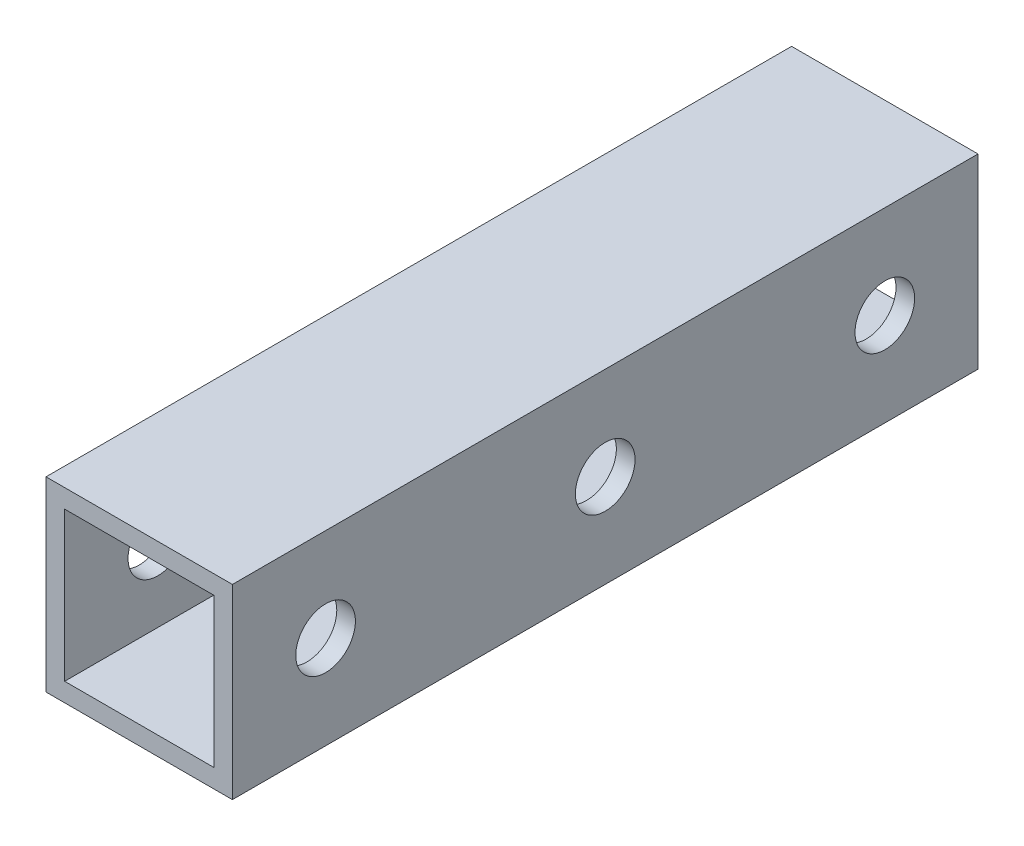
ISO-10303-21;
HEADER;
FILE_DESCRIPTION(('STEP AP214'),'2;1');
FILE_NAME('part.step','',(''),(''),'','','');
FILE_SCHEMA(('AUTOMOTIVE_DESIGN { 1 0 10303 214 1 1 1 1 }'));
ENDSEC;
DATA;
#1=APPLICATION_CONTEXT('core data for automotive mechanical design processes');
#2=APPLICATION_PROTOCOL_DEFINITION('international standard','automotive_design',2000,#1);
#3=PRODUCT_CONTEXT('',#1,'mechanical');
#4=PRODUCT('Part','Part','',(#3));
#5=PRODUCT_RELATED_PRODUCT_CATEGORY('part','',(#4));
#6=PRODUCT_DEFINITION_FORMATION('','',#4);
#7=PRODUCT_DEFINITION_CONTEXT('part definition',#1,'design');
#8=PRODUCT_DEFINITION('design','',#6,#7);
#9=PRODUCT_DEFINITION_SHAPE('','',#8);
#10=(LENGTH_UNIT() NAMED_UNIT(*) SI_UNIT(.MILLI.,.METRE.));
#11=(NAMED_UNIT(*) PLANE_ANGLE_UNIT() SI_UNIT($,.RADIAN.));
#12=(NAMED_UNIT(*) SI_UNIT($,.STERADIAN.) SOLID_ANGLE_UNIT());
#13=UNCERTAINTY_MEASURE_WITH_UNIT(LENGTH_MEASURE(1.E-05),#10,'distance_accuracy_value','');
#14=(GEOMETRIC_REPRESENTATION_CONTEXT(3) GLOBAL_UNCERTAINTY_ASSIGNED_CONTEXT((#13)) GLOBAL_UNIT_ASSIGNED_CONTEXT((#10,
#11,#12)) REPRESENTATION_CONTEXT('',''));
#15=CARTESIAN_POINT('',(0.,0.,0.));
#16=DIRECTION('',(0.,0.,1.));
#17=DIRECTION('',(1.,0.,0.));
#18=AXIS2_PLACEMENT_3D('',#15,#16,#17);
#19=CARTESIAN_POINT('',(0.,0.,40.));
#20=DIRECTION('',(0.,0.,1.));
#21=DIRECTION('',(1.,0.,0.));
#22=AXIS2_PLACEMENT_3D('',#19,#20,#21);
#23=PLANE('',#22);
#24=DIRECTION('',(0.,1.,0.));
#25=VECTOR('',#24,1.);
#26=CARTESIAN_POINT('',(5.,-5.,40.));
#27=LINE('',#26,#25);
#28=CARTESIAN_POINT('',(5.,-5.,40.));
#29=VERTEX_POINT('',#28);
#30=CARTESIAN_POINT('',(5.,5.,40.));
#31=VERTEX_POINT('',#30);
#32=EDGE_CURVE('E163',#29,#31,#27,.T.);
#33=ORIENTED_EDGE('',*,*,#32,.T.);
#34=DIRECTION('',(-1.,0.,0.));
#35=VECTOR('',#34,1.);
#36=CARTESIAN_POINT('',(-5.,5.,40.));
#37=LINE('',#36,#35);
#38=CARTESIAN_POINT('',(-5.,5.,40.));
#39=VERTEX_POINT('',#38);
#40=EDGE_CURVE('E166',#31,#39,#37,.T.);
#41=ORIENTED_EDGE('',*,*,#40,.T.);
#42=DIRECTION('',(0.,-1.,0.));
#43=VECTOR('',#42,1.);
#44=CARTESIAN_POINT('',(-5.,-5.,40.));
#45=LINE('',#44,#43);
#46=CARTESIAN_POINT('',(-5.,-5.,40.));
#47=VERTEX_POINT('',#46);
#48=EDGE_CURVE('E169',#39,#47,#45,.T.);
#49=ORIENTED_EDGE('',*,*,#48,.T.);
#50=DIRECTION('',(1.,0.,0.));
#51=VECTOR('',#50,1.);
#52=CARTESIAN_POINT('',(-5.,-5.,40.));
#53=LINE('',#52,#51);
#54=EDGE_CURVE('E171',#47,#29,#53,.T.);
#55=ORIENTED_EDGE('',*,*,#54,.T.);
#56=EDGE_LOOP('',(#33,#41,#49,#55));
#57=FACE_BOUND('',#56,.T.);
#58=DIRECTION('',(-1.,0.,0.));
#59=VECTOR('',#58,1.);
#60=CARTESIAN_POINT('',(0.,4.,40.));
#61=LINE('',#60,#59);
#62=CARTESIAN_POINT('',(4.,4.,40.));
#63=VERTEX_POINT('',#62);
#64=CARTESIAN_POINT('',(-4.,4.,40.));
#65=VERTEX_POINT('',#64);
#66=EDGE_CURVE('E133',#63,#65,#61,.T.);
#67=ORIENTED_EDGE('',*,*,#66,.F.);
#68=DIRECTION('',(0.,1.,0.));
#69=VECTOR('',#68,1.);
#70=CARTESIAN_POINT('',(4.,0.,40.));
#71=LINE('',#70,#69);
#72=CARTESIAN_POINT('',(4.,-4.,40.));
#73=VERTEX_POINT('',#72);
#74=EDGE_CURVE('E125',#73,#63,#71,.T.);
#75=ORIENTED_EDGE('',*,*,#74,.F.);
#76=DIRECTION('',(1.,0.,0.));
#77=VECTOR('',#76,1.);
#78=CARTESIAN_POINT('',(0.,-4.,40.));
#79=LINE('',#78,#77);
#80=CARTESIAN_POINT('',(-4.,-4.,40.));
#81=VERTEX_POINT('',#80);
#82=EDGE_CURVE('E147',#81,#73,#79,.T.);
#83=ORIENTED_EDGE('',*,*,#82,.F.);
#84=DIRECTION('',(0.,-1.,0.));
#85=VECTOR('',#84,1.);
#86=CARTESIAN_POINT('',(-4.,0.,40.));
#87=LINE('',#86,#85);
#88=EDGE_CURVE('E145',#65,#81,#87,.T.);
#89=ORIENTED_EDGE('',*,*,#88,.F.);
#90=EDGE_LOOP('',(#67,#75,#83,#89));
#91=FACE_BOUND('',#90,.T.);
#92=ADVANCED_FACE('F58',(#57,#91),#23,.T.);
#93=CARTESIAN_POINT('',(0.,0.,0.));
#94=DIRECTION('',(0.,0.,1.));
#95=DIRECTION('',(1.,0.,0.));
#96=AXIS2_PLACEMENT_3D('',#93,#94,#95);
#97=PLANE('',#96);
#98=DIRECTION('',(0.,1.,0.));
#99=VECTOR('',#98,1.);
#100=CARTESIAN_POINT('',(5.,-5.,0.));
#101=LINE('',#100,#99);
#102=CARTESIAN_POINT('',(5.,-5.,0.));
#103=VERTEX_POINT('',#102);
#104=CARTESIAN_POINT('',(5.,5.,0.));
#105=VERTEX_POINT('',#104);
#106=EDGE_CURVE('E141',#103,#105,#101,.T.);
#107=ORIENTED_EDGE('',*,*,#106,.F.);
#108=DIRECTION('',(1.,0.,0.));
#109=VECTOR('',#108,1.);
#110=CARTESIAN_POINT('',(-5.,-5.,0.));
#111=LINE('',#110,#109);
#112=CARTESIAN_POINT('',(-5.,-5.,0.));
#113=VERTEX_POINT('',#112);
#114=EDGE_CURVE('E167',#113,#103,#111,.T.);
#115=ORIENTED_EDGE('',*,*,#114,.F.);
#116=DIRECTION('',(0.,-1.,0.));
#117=VECTOR('',#116,1.);
#118=CARTESIAN_POINT('',(-5.,-5.,0.));
#119=LINE('',#118,#117);
#120=CARTESIAN_POINT('',(-5.,5.,0.));
#121=VERTEX_POINT('',#120);
#122=EDGE_CURVE('E178',#121,#113,#119,.T.);
#123=ORIENTED_EDGE('',*,*,#122,.F.);
#124=DIRECTION('',(-1.,0.,0.));
#125=VECTOR('',#124,1.);
#126=CARTESIAN_POINT('',(-5.,5.,0.));
#127=LINE('',#126,#125);
#128=EDGE_CURVE('E176',#105,#121,#127,.T.);
#129=ORIENTED_EDGE('',*,*,#128,.F.);
#130=EDGE_LOOP('',(#107,#115,#123,#129));
#131=FACE_BOUND('',#130,.T.);
#132=DIRECTION('',(0.,1.,0.));
#133=VECTOR('',#132,1.);
#134=CARTESIAN_POINT('',(4.,0.,0.));
#135=LINE('',#134,#133);
#136=CARTESIAN_POINT('',(4.,-4.,0.));
#137=VERTEX_POINT('',#136);
#138=CARTESIAN_POINT('',(4.,4.,0.));
#139=VERTEX_POINT('',#138);
#140=EDGE_CURVE('E83',#137,#139,#135,.T.);
#141=ORIENTED_EDGE('',*,*,#140,.T.);
#142=DIRECTION('',(-1.,0.,0.));
#143=VECTOR('',#142,1.);
#144=CARTESIAN_POINT('',(0.,4.,0.));
#145=LINE('',#144,#143);
#146=CARTESIAN_POINT('',(-4.,4.,0.));
#147=VERTEX_POINT('',#146);
#148=EDGE_CURVE('E140',#139,#147,#145,.T.);
#149=ORIENTED_EDGE('',*,*,#148,.T.);
#150=DIRECTION('',(0.,-1.,0.));
#151=VECTOR('',#150,1.);
#152=CARTESIAN_POINT('',(-4.,0.,0.));
#153=LINE('',#152,#151);
#154=CARTESIAN_POINT('',(-4.,-4.,0.));
#155=VERTEX_POINT('',#154);
#156=EDGE_CURVE('E155',#147,#155,#153,.T.);
#157=ORIENTED_EDGE('',*,*,#156,.T.);
#158=DIRECTION('',(1.,0.,0.));
#159=VECTOR('',#158,1.);
#160=CARTESIAN_POINT('',(0.,-4.,0.));
#161=LINE('',#160,#159);
#162=EDGE_CURVE('E134',#155,#137,#161,.T.);
#163=ORIENTED_EDGE('',*,*,#162,.T.);
#164=EDGE_LOOP('',(#141,#149,#157,#163));
#165=FACE_BOUND('',#164,.T.);
#166=ADVANCED_FACE('F225',(#131,#165),#97,.F.);
#167=CARTESIAN_POINT('',(5.,-5.,40.));
#168=DIRECTION('',(-1.,0.,0.));
#169=DIRECTION('',(0.,0.,1.));
#170=AXIS2_PLACEMENT_3D('',#167,#168,#169);
#171=PLANE('',#170);
#172=CARTESIAN_POINT('',(5.,0.,35.));
#173=DIRECTION('',(1.,0.,0.));
#174=DIRECTION('',(0.,0.,-1.));
#175=AXIS2_PLACEMENT_3D('',#172,#173,#174);
#176=CIRCLE('',#175,1.6);
#177=CARTESIAN_POINT('',(5.,0.,33.4));
#178=VERTEX_POINT('',#177);
#179=EDGE_CURVE('E278',#178,#178,#176,.T.);
#180=ORIENTED_EDGE('',*,*,#179,.F.);
#181=EDGE_LOOP('',(#180));
#182=FACE_BOUND('',#181,.T.);
#183=CARTESIAN_POINT('',(5.,0.,20.));
#184=DIRECTION('',(1.,0.,0.));
#185=DIRECTION('',(0.,0.,-1.));
#186=AXIS2_PLACEMENT_3D('',#183,#184,#185);
#187=CIRCLE('',#186,1.6);
#188=CARTESIAN_POINT('',(5.,0.,18.4));
#189=VERTEX_POINT('',#188);
#190=EDGE_CURVE('E282',#189,#189,#187,.T.);
#191=ORIENTED_EDGE('',*,*,#190,.F.);
#192=EDGE_LOOP('',(#191));
#193=FACE_BOUND('',#192,.T.);
#194=CARTESIAN_POINT('',(5.,0.,5.));
#195=DIRECTION('',(1.,0.,0.));
#196=DIRECTION('',(0.,0.,-1.));
#197=AXIS2_PLACEMENT_3D('',#194,#195,#196);
#198=CIRCLE('',#197,1.6);
#199=CARTESIAN_POINT('',(5.,0.,3.4));
#200=VERTEX_POINT('',#199);
#201=EDGE_CURVE('E204',#200,#200,#198,.T.);
#202=ORIENTED_EDGE('',*,*,#201,.F.);
#203=EDGE_LOOP('',(#202));
#204=FACE_BOUND('',#203,.T.);
#205=ORIENTED_EDGE('',*,*,#106,.T.);
#206=DIRECTION('',(0.,0.,-1.));
#207=VECTOR('',#206,1.);
#208=CARTESIAN_POINT('',(5.,5.,40.));
#209=LINE('',#208,#207);
#210=EDGE_CURVE('E12',#31,#105,#209,.T.);
#211=ORIENTED_EDGE('',*,*,#210,.F.);
#212=ORIENTED_EDGE('',*,*,#32,.F.);
#213=DIRECTION('',(0.,0.,-1.));
#214=VECTOR('',#213,1.);
#215=CARTESIAN_POINT('',(5.,-5.,40.));
#216=LINE('',#215,#214);
#217=EDGE_CURVE('E173',#29,#103,#216,.T.);
#218=ORIENTED_EDGE('',*,*,#217,.T.);
#219=EDGE_LOOP('',(#205,#211,#212,#218));
#220=FACE_BOUND('',#219,.T.);
#221=ADVANCED_FACE('F60',(#182,#193,#204,#220),#171,.F.);
#222=CARTESIAN_POINT('',(-5.,5.,40.));
#223=DIRECTION('',(0.,-1.,0.));
#224=DIRECTION('',(0.,0.,-1.));
#225=AXIS2_PLACEMENT_3D('',#222,#223,#224);
#226=PLANE('',#225);
#227=ORIENTED_EDGE('',*,*,#128,.T.);
#228=DIRECTION('',(0.,0.,-1.));
#229=VECTOR('',#228,1.);
#230=CARTESIAN_POINT('',(-5.,5.,40.));
#231=LINE('',#230,#229);
#232=EDGE_CURVE('E67',#39,#121,#231,.T.);
#233=ORIENTED_EDGE('',*,*,#232,.F.);
#234=ORIENTED_EDGE('',*,*,#40,.F.);
#235=ORIENTED_EDGE('',*,*,#210,.T.);
#236=EDGE_LOOP('',(#227,#233,#234,#235));
#237=FACE_BOUND('',#236,.T.);
#238=ADVANCED_FACE('F253',(#237),#226,.F.);
#239=CARTESIAN_POINT('',(-5.,-5.,40.));
#240=DIRECTION('',(1.,0.,0.));
#241=DIRECTION('',(0.,0.,-1.));
#242=AXIS2_PLACEMENT_3D('',#239,#240,#241);
#243=PLANE('',#242);
#244=CARTESIAN_POINT('',(-5.,0.,35.));
#245=DIRECTION('',(1.,0.,0.));
#246=DIRECTION('',(0.,0.,-1.));
#247=AXIS2_PLACEMENT_3D('',#244,#245,#246);
#248=CIRCLE('',#247,1.6);
#249=CARTESIAN_POINT('',(-5.,0.,33.4));
#250=VERTEX_POINT('',#249);
#251=EDGE_CURVE('E191',#250,#250,#248,.T.);
#252=ORIENTED_EDGE('',*,*,#251,.T.);
#253=EDGE_LOOP('',(#252));
#254=FACE_BOUND('',#253,.T.);
#255=CARTESIAN_POINT('',(-5.,0.,20.));
#256=DIRECTION('',(1.,0.,0.));
#257=DIRECTION('',(0.,0.,-1.));
#258=AXIS2_PLACEMENT_3D('',#255,#256,#257);
#259=CIRCLE('',#258,1.6);
#260=CARTESIAN_POINT('',(-5.,0.,18.4));
#261=VERTEX_POINT('',#260);
#262=EDGE_CURVE('E290',#261,#261,#259,.T.);
#263=ORIENTED_EDGE('',*,*,#262,.T.);
#264=EDGE_LOOP('',(#263));
#265=FACE_BOUND('',#264,.T.);
#266=CARTESIAN_POINT('',(-5.,0.,5.));
#267=DIRECTION('',(1.,0.,0.));
#268=DIRECTION('',(0.,0.,-1.));
#269=AXIS2_PLACEMENT_3D('',#266,#267,#268);
#270=CIRCLE('',#269,1.6);
#271=CARTESIAN_POINT('',(-5.,0.,3.4));
#272=VERTEX_POINT('',#271);
#273=EDGE_CURVE('E286',#272,#272,#270,.T.);
#274=ORIENTED_EDGE('',*,*,#273,.T.);
#275=EDGE_LOOP('',(#274));
#276=FACE_BOUND('',#275,.T.);
#277=ORIENTED_EDGE('',*,*,#122,.T.);
#278=DIRECTION('',(0.,0.,-1.));
#279=VECTOR('',#278,1.);
#280=CARTESIAN_POINT('',(-5.,-5.,40.));
#281=LINE('',#280,#279);
#282=EDGE_CURVE('E183',#47,#113,#281,.T.);
#283=ORIENTED_EDGE('',*,*,#282,.F.);
#284=ORIENTED_EDGE('',*,*,#48,.F.);
#285=ORIENTED_EDGE('',*,*,#232,.T.);
#286=EDGE_LOOP('',(#277,#283,#284,#285));
#287=FACE_BOUND('',#286,.T.);
#288=ADVANCED_FACE('F250',(#254,#265,#276,#287),#243,.F.);
#289=CARTESIAN_POINT('',(-5.,-5.,40.));
#290=DIRECTION('',(0.,1.,0.));
#291=DIRECTION('',(0.,0.,1.));
#292=AXIS2_PLACEMENT_3D('',#289,#290,#291);
#293=PLANE('',#292);
#294=ORIENTED_EDGE('',*,*,#114,.T.);
#295=ORIENTED_EDGE('',*,*,#217,.F.);
#296=ORIENTED_EDGE('',*,*,#54,.F.);
#297=ORIENTED_EDGE('',*,*,#282,.T.);
#298=EDGE_LOOP('',(#294,#295,#296,#297));
#299=FACE_BOUND('',#298,.T.);
#300=ADVANCED_FACE('F247',(#299),#293,.F.);
#301=CARTESIAN_POINT('',(4.,0.,40.));
#302=DIRECTION('',(-1.,0.,0.));
#303=DIRECTION('',(0.,0.,1.));
#304=AXIS2_PLACEMENT_3D('',#301,#302,#303);
#305=PLANE('',#304);
#306=CARTESIAN_POINT('',(4.,0.,35.));
#307=DIRECTION('',(-1.,0.,0.));
#308=DIRECTION('',(0.,0.,1.));
#309=AXIS2_PLACEMENT_3D('',#306,#307,#308);
#310=CIRCLE('',#309,1.6);
#311=CARTESIAN_POINT('',(4.,0.,36.6));
#312=VERTEX_POINT('',#311);
#313=EDGE_CURVE('E153',#312,#312,#310,.T.);
#314=ORIENTED_EDGE('',*,*,#313,.F.);
#315=EDGE_LOOP('',(#314));
#316=FACE_BOUND('',#315,.T.);
#317=CARTESIAN_POINT('',(4.,0.,20.));
#318=DIRECTION('',(-1.,0.,0.));
#319=DIRECTION('',(0.,0.,1.));
#320=AXIS2_PLACEMENT_3D('',#317,#318,#319);
#321=CIRCLE('',#320,1.6);
#322=CARTESIAN_POINT('',(4.,0.,21.6));
#323=VERTEX_POINT('',#322);
#324=EDGE_CURVE('E194',#323,#323,#321,.T.);
#325=ORIENTED_EDGE('',*,*,#324,.F.);
#326=EDGE_LOOP('',(#325));
#327=FACE_BOUND('',#326,.T.);
#328=CARTESIAN_POINT('',(4.,0.,5.));
#329=DIRECTION('',(-1.,0.,0.));
#330=DIRECTION('',(0.,0.,1.));
#331=AXIS2_PLACEMENT_3D('',#328,#329,#330);
#332=CIRCLE('',#331,1.6);
#333=CARTESIAN_POINT('',(4.,0.,6.6));
#334=VERTEX_POINT('',#333);
#335=EDGE_CURVE('E190',#334,#334,#332,.T.);
#336=ORIENTED_EDGE('',*,*,#335,.F.);
#337=EDGE_LOOP('',(#336));
#338=FACE_BOUND('',#337,.T.);
#339=ORIENTED_EDGE('',*,*,#140,.F.);
#340=DIRECTION('',(0.,0.,-1.));
#341=VECTOR('',#340,1.);
#342=CARTESIAN_POINT('',(4.,-4.,40.));
#343=LINE('',#342,#341);
#344=EDGE_CURVE('E129',#73,#137,#343,.T.);
#345=ORIENTED_EDGE('',*,*,#344,.F.);
#346=ORIENTED_EDGE('',*,*,#74,.T.);
#347=DIRECTION('',(0.,0.,-1.));
#348=VECTOR('',#347,1.);
#349=CARTESIAN_POINT('',(4.,4.,40.));
#350=LINE('',#349,#348);
#351=EDGE_CURVE('E128',#63,#139,#350,.T.);
#352=ORIENTED_EDGE('',*,*,#351,.T.);
#353=EDGE_LOOP('',(#339,#345,#346,#352));
#354=FACE_BOUND('',#353,.T.);
#355=ADVANCED_FACE('F127',(#316,#327,#338,#354),#305,.T.);
#356=CARTESIAN_POINT('',(0.,4.,40.));
#357=DIRECTION('',(0.,-1.,0.));
#358=DIRECTION('',(0.,0.,-1.));
#359=AXIS2_PLACEMENT_3D('',#356,#357,#358);
#360=PLANE('',#359);
#361=ORIENTED_EDGE('',*,*,#148,.F.);
#362=ORIENTED_EDGE('',*,*,#351,.F.);
#363=ORIENTED_EDGE('',*,*,#66,.T.);
#364=DIRECTION('',(0.,0.,-1.));
#365=VECTOR('',#364,1.);
#366=CARTESIAN_POINT('',(-4.,4.,40.));
#367=LINE('',#366,#365);
#368=EDGE_CURVE('E142',#65,#147,#367,.T.);
#369=ORIENTED_EDGE('',*,*,#368,.T.);
#370=EDGE_LOOP('',(#361,#362,#363,#369));
#371=FACE_BOUND('',#370,.T.);
#372=ADVANCED_FACE('F137',(#371),#360,.T.);
#373=CARTESIAN_POINT('',(-4.,0.,40.));
#374=DIRECTION('',(1.,0.,0.));
#375=DIRECTION('',(0.,0.,-1.));
#376=AXIS2_PLACEMENT_3D('',#373,#374,#375);
#377=PLANE('',#376);
#378=CARTESIAN_POINT('',(-4.,0.,35.));
#379=DIRECTION('',(1.,0.,0.));
#380=DIRECTION('',(0.,0.,-1.));
#381=AXIS2_PLACEMENT_3D('',#378,#379,#380);
#382=CIRCLE('',#381,1.6);
#383=CARTESIAN_POINT('',(-4.,0.,33.4));
#384=VERTEX_POINT('',#383);
#385=EDGE_CURVE('E62',#384,#384,#382,.T.);
#386=ORIENTED_EDGE('',*,*,#385,.F.);
#387=EDGE_LOOP('',(#386));
#388=FACE_BOUND('',#387,.T.);
#389=CARTESIAN_POINT('',(-4.,0.,20.));
#390=DIRECTION('',(1.,0.,0.));
#391=DIRECTION('',(0.,0.,-1.));
#392=AXIS2_PLACEMENT_3D('',#389,#390,#391);
#393=CIRCLE('',#392,1.6);
#394=CARTESIAN_POINT('',(-4.,0.,18.4));
#395=VERTEX_POINT('',#394);
#396=EDGE_CURVE('E192',#395,#395,#393,.T.);
#397=ORIENTED_EDGE('',*,*,#396,.F.);
#398=EDGE_LOOP('',(#397));
#399=FACE_BOUND('',#398,.T.);
#400=CARTESIAN_POINT('',(-4.,0.,5.));
#401=DIRECTION('',(1.,0.,0.));
#402=DIRECTION('',(0.,0.,-1.));
#403=AXIS2_PLACEMENT_3D('',#400,#401,#402);
#404=CIRCLE('',#403,1.6);
#405=CARTESIAN_POINT('',(-4.,0.,3.4));
#406=VERTEX_POINT('',#405);
#407=EDGE_CURVE('E188',#406,#406,#404,.T.);
#408=ORIENTED_EDGE('',*,*,#407,.F.);
#409=EDGE_LOOP('',(#408));
#410=FACE_BOUND('',#409,.T.);
#411=ORIENTED_EDGE('',*,*,#156,.F.);
#412=ORIENTED_EDGE('',*,*,#368,.F.);
#413=ORIENTED_EDGE('',*,*,#88,.T.);
#414=DIRECTION('',(0.,0.,-1.));
#415=VECTOR('',#414,1.);
#416=CARTESIAN_POINT('',(-4.,-4.,40.));
#417=LINE('',#416,#415);
#418=EDGE_CURVE('E75',#81,#155,#417,.T.);
#419=ORIENTED_EDGE('',*,*,#418,.T.);
#420=EDGE_LOOP('',(#411,#412,#413,#419));
#421=FACE_BOUND('',#420,.T.);
#422=ADVANCED_FACE('F215',(#388,#399,#410,#421),#377,.T.);
#423=CARTESIAN_POINT('',(0.,-4.,40.));
#424=DIRECTION('',(0.,1.,0.));
#425=DIRECTION('',(0.,0.,1.));
#426=AXIS2_PLACEMENT_3D('',#423,#424,#425);
#427=PLANE('',#426);
#428=ORIENTED_EDGE('',*,*,#162,.F.);
#429=ORIENTED_EDGE('',*,*,#418,.F.);
#430=ORIENTED_EDGE('',*,*,#82,.T.);
#431=ORIENTED_EDGE('',*,*,#344,.T.);
#432=EDGE_LOOP('',(#428,#429,#430,#431));
#433=FACE_BOUND('',#432,.T.);
#434=ADVANCED_FACE('F218',(#433),#427,.T.);
#435=CARTESIAN_POINT('',(-5.,0.,5.));
#436=DIRECTION('',(1.,0.,0.));
#437=DIRECTION('',(0.,0.,-1.));
#438=AXIS2_PLACEMENT_3D('',#435,#436,#437);
#439=CYLINDRICAL_SURFACE('',#438,1.6);
#440=ORIENTED_EDGE('',*,*,#407,.T.);
#441=EDGE_LOOP('',(#440));
#442=FACE_BOUND('',#441,.T.);
#443=ORIENTED_EDGE('',*,*,#273,.F.);
#444=EDGE_LOOP('',(#443));
#445=FACE_BOUND('',#444,.T.);
#446=ADVANCED_FACE('F227',(#442,#445),#439,.F.);
#447=CARTESIAN_POINT('',(-5.,0.,20.));
#448=DIRECTION('',(1.,0.,0.));
#449=DIRECTION('',(0.,0.,-1.));
#450=AXIS2_PLACEMENT_3D('',#447,#448,#449);
#451=CYLINDRICAL_SURFACE('',#450,1.6);
#452=ORIENTED_EDGE('',*,*,#396,.T.);
#453=EDGE_LOOP('',(#452));
#454=FACE_BOUND('',#453,.T.);
#455=ORIENTED_EDGE('',*,*,#262,.F.);
#456=EDGE_LOOP('',(#455));
#457=FACE_BOUND('',#456,.T.);
#458=ADVANCED_FACE('F232',(#454,#457),#451,.F.);
#459=CARTESIAN_POINT('',(-5.,0.,35.));
#460=DIRECTION('',(1.,0.,0.));
#461=DIRECTION('',(0.,0.,-1.));
#462=AXIS2_PLACEMENT_3D('',#459,#460,#461);
#463=CYLINDRICAL_SURFACE('',#462,1.6);
#464=ORIENTED_EDGE('',*,*,#385,.T.);
#465=EDGE_LOOP('',(#464));
#466=FACE_BOUND('',#465,.T.);
#467=ORIENTED_EDGE('',*,*,#251,.F.);
#468=EDGE_LOOP('',(#467));
#469=FACE_BOUND('',#468,.T.);
#470=ADVANCED_FACE('F212',(#466,#469),#463,.F.);
#471=ORIENTED_EDGE('',*,*,#335,.T.);
#472=EDGE_LOOP('',(#471));
#473=FACE_BOUND('',#472,.T.);
#474=ORIENTED_EDGE('',*,*,#201,.T.);
#475=EDGE_LOOP('',(#474));
#476=FACE_BOUND('',#475,.T.);
#477=ADVANCED_FACE('F235',(#473,#476),#439,.F.);
#478=ORIENTED_EDGE('',*,*,#324,.T.);
#479=EDGE_LOOP('',(#478));
#480=FACE_BOUND('',#479,.T.);
#481=ORIENTED_EDGE('',*,*,#190,.T.);
#482=EDGE_LOOP('',(#481));
#483=FACE_BOUND('',#482,.T.);
#484=ADVANCED_FACE('F306',(#480,#483),#451,.F.);
#485=ORIENTED_EDGE('',*,*,#313,.T.);
#486=EDGE_LOOP('',(#485));
#487=FACE_BOUND('',#486,.T.);
#488=ORIENTED_EDGE('',*,*,#179,.T.);
#489=EDGE_LOOP('',(#488));
#490=FACE_BOUND('',#489,.T.);
#491=ADVANCED_FACE('F301',(#487,#490),#463,.F.);
#492=CLOSED_SHELL('',(#92,#166,#221,#238,#288,#300,#355,#372,#422,#434,#446,#458,#470,#477,#484,#491));
#493=MANIFOLD_SOLID_BREP('B2',#492);
#494=ADVANCED_BREP_SHAPE_REPRESENTATION('',(#18,#493),#14);
#495=SHAPE_DEFINITION_REPRESENTATION(#9,#494);
ENDSEC;
END-ISO-10303-21;
